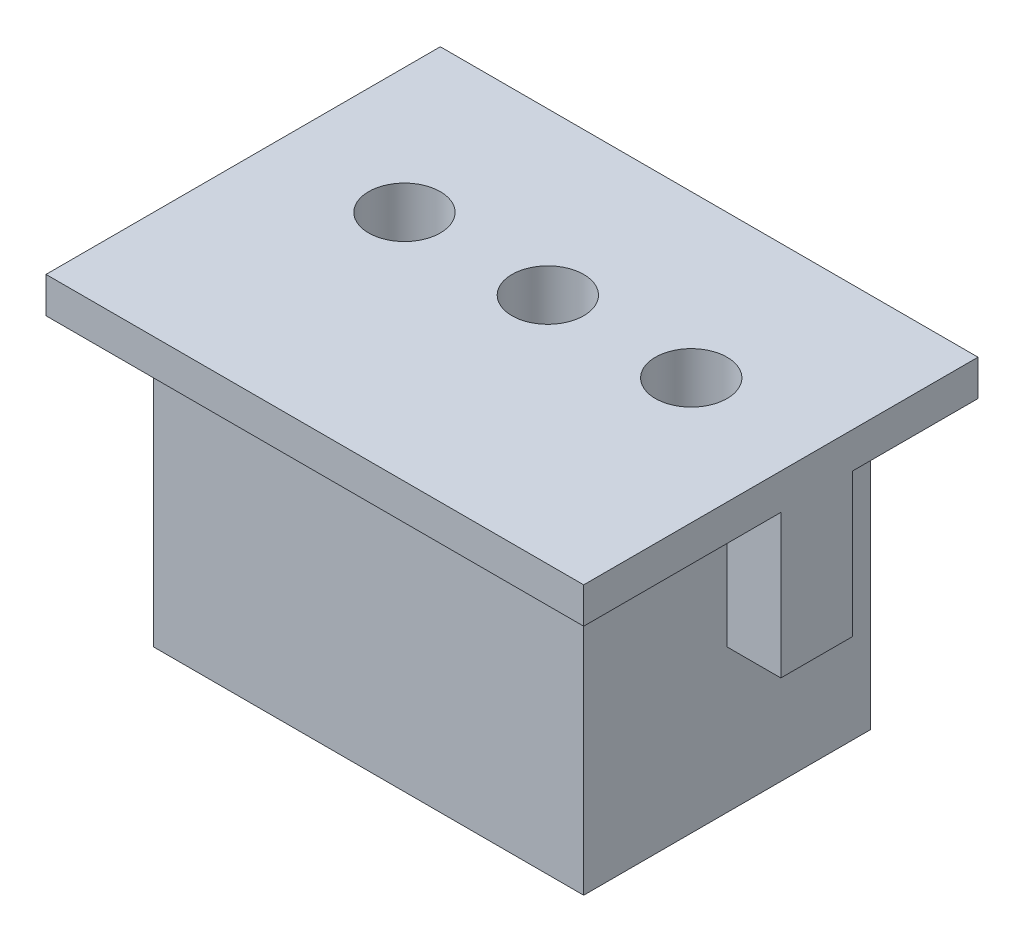
ISO-10303-21;
HEADER;
FILE_DESCRIPTION(('STEP AP214'),'2;1');
FILE_NAME('part.step','',(''),(''),'','','');
FILE_SCHEMA(('AUTOMOTIVE_DESIGN { 1 0 10303 214 1 1 1 1 }'));
ENDSEC;
DATA;
#1=APPLICATION_CONTEXT('core data for automotive mechanical design processes');
#2=APPLICATION_PROTOCOL_DEFINITION('international standard','automotive_design',2000,#1);
#3=PRODUCT_CONTEXT('',#1,'mechanical');
#4=PRODUCT('Part','Part','',(#3));
#5=PRODUCT_RELATED_PRODUCT_CATEGORY('part','',(#4));
#6=PRODUCT_DEFINITION_FORMATION('','',#4);
#7=PRODUCT_DEFINITION_CONTEXT('part definition',#1,'design');
#8=PRODUCT_DEFINITION('design','',#6,#7);
#9=PRODUCT_DEFINITION_SHAPE('','',#8);
#10=(LENGTH_UNIT() NAMED_UNIT(*) SI_UNIT(.MILLI.,.METRE.));
#11=(NAMED_UNIT(*) PLANE_ANGLE_UNIT() SI_UNIT($,.RADIAN.));
#12=(NAMED_UNIT(*) SI_UNIT($,.STERADIAN.) SOLID_ANGLE_UNIT());
#13=UNCERTAINTY_MEASURE_WITH_UNIT(LENGTH_MEASURE(1.E-05),#10,'distance_accuracy_value','');
#14=(GEOMETRIC_REPRESENTATION_CONTEXT(3) GLOBAL_UNCERTAINTY_ASSIGNED_CONTEXT((#13)) GLOBAL_UNIT_ASSIGNED_CONTEXT((#10,
#11,#12)) REPRESENTATION_CONTEXT('',''));
#15=CARTESIAN_POINT('',(0.,0.,0.));
#16=DIRECTION('',(0.,0.,1.));
#17=DIRECTION('',(1.,0.,0.));
#18=AXIS2_PLACEMENT_3D('',#15,#16,#17);
#19=CARTESIAN_POINT('',(3.,4.,2.));
#20=DIRECTION('',(-1.,0.,0.));
#21=DIRECTION('',(0.,0.,1.));
#22=AXIS2_PLACEMENT_3D('',#19,#20,#21);
#23=PLANE('',#22);
#24=DIRECTION('',(0.,1.,0.));
#25=VECTOR('',#24,1.);
#26=CARTESIAN_POINT('',(3.,2.,-1.));
#27=LINE('',#26,#25);
#28=CARTESIAN_POINT('',(3.,2.,-1.));
#29=VERTEX_POINT('',#28);
#30=CARTESIAN_POINT('',(3.,4.,-1.));
#31=VERTEX_POINT('',#30);
#32=EDGE_CURVE('E64',#29,#31,#27,.T.);
#33=ORIENTED_EDGE('',*,*,#32,.F.);
#34=DIRECTION('',(0.,0.,-1.));
#35=VECTOR('',#34,1.);
#36=CARTESIAN_POINT('',(3.,2.,0.));
#37=LINE('',#36,#35);
#38=CARTESIAN_POINT('',(3.,2.,0.));
#39=VERTEX_POINT('',#38);
#40=EDGE_CURVE('E360',#39,#29,#37,.T.);
#41=ORIENTED_EDGE('',*,*,#40,.F.);
#42=DIRECTION('',(0.,-1.,0.));
#43=VECTOR('',#42,1.);
#44=CARTESIAN_POINT('',(3.,4.,0.));
#45=LINE('',#44,#43);
#46=CARTESIAN_POINT('',(3.,4.,0.));
#47=VERTEX_POINT('',#46);
#48=EDGE_CURVE('E380',#47,#39,#45,.T.);
#49=ORIENTED_EDGE('',*,*,#48,.F.);
#50=DIRECTION('',(0.,0.,-1.));
#51=VECTOR('',#50,1.);
#52=CARTESIAN_POINT('',(3.,4.,2.));
#53=LINE('',#52,#51);
#54=CARTESIAN_POINT('',(3.,4.,2.));
#55=VERTEX_POINT('',#54);
#56=EDGE_CURVE('E328',#55,#47,#53,.T.);
#57=ORIENTED_EDGE('',*,*,#56,.F.);
#58=DIRECTION('',(0.,-1.,0.));
#59=VECTOR('',#58,1.);
#60=CARTESIAN_POINT('',(3.,4.,2.));
#61=LINE('',#60,#59);
#62=CARTESIAN_POINT('',(3.,0.,2.));
#63=VERTEX_POINT('',#62);
#64=EDGE_CURVE('E320',#55,#63,#61,.T.);
#65=ORIENTED_EDGE('',*,*,#64,.T.);
#66=DIRECTION('',(0.,0.,-1.));
#67=VECTOR('',#66,1.);
#68=CARTESIAN_POINT('',(3.,0.,2.));
#69=LINE('',#68,#67);
#70=CARTESIAN_POINT('',(3.,0.,-2.));
#71=VERTEX_POINT('',#70);
#72=EDGE_CURVE('E298',#63,#71,#69,.T.);
#73=ORIENTED_EDGE('',*,*,#72,.T.);
#74=DIRECTION('',(0.,-1.,0.));
#75=VECTOR('',#74,1.);
#76=CARTESIAN_POINT('',(3.,4.,-2.));
#77=LINE('',#76,#75);
#78=CARTESIAN_POINT('',(3.,4.,-2.));
#79=VERTEX_POINT('',#78);
#80=EDGE_CURVE('E11',#79,#71,#77,.T.);
#81=ORIENTED_EDGE('',*,*,#80,.F.);
#82=EDGE_CURVE('E319',#31,#79,#53,.T.);
#83=ORIENTED_EDGE('',*,*,#82,.F.);
#84=EDGE_LOOP('',(#33,#41,#49,#57,#65,#73,#81,#83));
#85=FACE_BOUND('',#84,.T.);
#86=ADVANCED_FACE('F39',(#85),#23,.F.);
#87=CARTESIAN_POINT('',(-3.,4.,-2.));
#88=DIRECTION('',(0.,0.,1.));
#89=DIRECTION('',(1.,0.,0.));
#90=AXIS2_PLACEMENT_3D('',#87,#88,#89);
#91=PLANE('',#90);
#92=DIRECTION('',(-1.,0.,0.));
#93=VECTOR('',#92,1.);
#94=CARTESIAN_POINT('',(-3.,0.,-2.));
#95=LINE('',#94,#93);
#96=CARTESIAN_POINT('',(-3.,0.,-2.));
#97=VERTEX_POINT('',#96);
#98=EDGE_CURVE('E301',#71,#97,#95,.T.);
#99=ORIENTED_EDGE('',*,*,#98,.T.);
#100=DIRECTION('',(0.,-1.,0.));
#101=VECTOR('',#100,1.);
#102=CARTESIAN_POINT('',(-3.,4.,-2.));
#103=LINE('',#102,#101);
#104=CARTESIAN_POINT('',(-3.,4.,-2.));
#105=VERTEX_POINT('',#104);
#106=EDGE_CURVE('E48',#105,#97,#103,.T.);
#107=ORIENTED_EDGE('',*,*,#106,.F.);
#108=DIRECTION('',(-1.,0.,0.));
#109=VECTOR('',#108,1.);
#110=CARTESIAN_POINT('',(-3.,4.,-2.));
#111=LINE('',#110,#109);
#112=EDGE_CURVE('E332',#79,#105,#111,.T.);
#113=ORIENTED_EDGE('',*,*,#112,.F.);
#114=ORIENTED_EDGE('',*,*,#80,.T.);
#115=EDGE_LOOP('',(#99,#107,#113,#114));
#116=FACE_BOUND('',#115,.T.);
#117=ADVANCED_FACE('F433',(#116),#91,.F.);
#118=CARTESIAN_POINT('',(-3.,4.,2.));
#119=DIRECTION('',(1.,0.,0.));
#120=DIRECTION('',(0.,0.,-1.));
#121=AXIS2_PLACEMENT_3D('',#118,#119,#120);
#122=PLANE('',#121);
#123=DIRECTION('',(0.,0.,1.));
#124=VECTOR('',#123,1.);
#125=CARTESIAN_POINT('',(-3.,4.,2.));
#126=LINE('',#125,#124);
#127=CARTESIAN_POINT('',(-3.,4.,0.));
#128=VERTEX_POINT('',#127);
#129=CARTESIAN_POINT('',(-3.,4.,2.));
#130=VERTEX_POINT('',#129);
#131=EDGE_CURVE('E341',#128,#130,#126,.T.);
#132=ORIENTED_EDGE('',*,*,#131,.F.);
#133=DIRECTION('',(0.,-1.,0.));
#134=VECTOR('',#133,1.);
#135=CARTESIAN_POINT('',(-3.,4.,0.));
#136=LINE('',#135,#134);
#137=CARTESIAN_POINT('',(-3.,2.,0.));
#138=VERTEX_POINT('',#137);
#139=EDGE_CURVE('E397',#128,#138,#136,.T.);
#140=ORIENTED_EDGE('',*,*,#139,.T.);
#141=DIRECTION('',(0.,0.,-1.));
#142=VECTOR('',#141,1.);
#143=CARTESIAN_POINT('',(-3.,2.,0.));
#144=LINE('',#143,#142);
#145=CARTESIAN_POINT('',(-3.,2.,-1.));
#146=VERTEX_POINT('',#145);
#147=EDGE_CURVE('E196',#138,#146,#144,.T.);
#148=ORIENTED_EDGE('',*,*,#147,.T.);
#149=DIRECTION('',(0.,1.,0.));
#150=VECTOR('',#149,1.);
#151=CARTESIAN_POINT('',(-3.,2.,-1.));
#152=LINE('',#151,#150);
#153=CARTESIAN_POINT('',(-3.,4.,-1.));
#154=VERTEX_POINT('',#153);
#155=EDGE_CURVE('E194',#146,#154,#152,.T.);
#156=ORIENTED_EDGE('',*,*,#155,.T.);
#157=EDGE_CURVE('E346',#105,#154,#126,.T.);
#158=ORIENTED_EDGE('',*,*,#157,.F.);
#159=ORIENTED_EDGE('',*,*,#106,.T.);
#160=DIRECTION('',(0.,0.,1.));
#161=VECTOR('',#160,1.);
#162=CARTESIAN_POINT('',(-3.,0.,2.));
#163=LINE('',#162,#161);
#164=CARTESIAN_POINT('',(-3.,0.,2.));
#165=VERTEX_POINT('',#164);
#166=EDGE_CURVE('E308',#97,#165,#163,.T.);
#167=ORIENTED_EDGE('',*,*,#166,.T.);
#168=DIRECTION('',(0.,-1.,0.));
#169=VECTOR('',#168,1.);
#170=CARTESIAN_POINT('',(-3.,4.,2.));
#171=LINE('',#170,#169);
#172=EDGE_CURVE('E323',#130,#165,#171,.T.);
#173=ORIENTED_EDGE('',*,*,#172,.F.);
#174=EDGE_LOOP('',(#132,#140,#148,#156,#158,#159,#167,#173));
#175=FACE_BOUND('',#174,.T.);
#176=ADVANCED_FACE('F428',(#175),#122,.F.);
#177=CARTESIAN_POINT('',(-3.,4.,2.));
#178=DIRECTION('',(0.,0.,-1.));
#179=DIRECTION('',(-1.,0.,0.));
#180=AXIS2_PLACEMENT_3D('',#177,#178,#179);
#181=PLANE('',#180);
#182=DIRECTION('',(1.,0.,0.));
#183=VECTOR('',#182,1.);
#184=CARTESIAN_POINT('',(-3.,0.,2.));
#185=LINE('',#184,#183);
#186=EDGE_CURVE('E300',#165,#63,#185,.T.);
#187=ORIENTED_EDGE('',*,*,#186,.T.);
#188=ORIENTED_EDGE('',*,*,#64,.F.);
#189=DIRECTION('',(1.,0.,0.));
#190=VECTOR('',#189,1.);
#191=CARTESIAN_POINT('',(-3.,4.,2.));
#192=LINE('',#191,#190);
#193=EDGE_CURVE('E314',#130,#55,#192,.T.);
#194=ORIENTED_EDGE('',*,*,#193,.F.);
#195=ORIENTED_EDGE('',*,*,#172,.T.);
#196=EDGE_LOOP('',(#187,#188,#194,#195));
#197=FACE_BOUND('',#196,.T.);
#198=ADVANCED_FACE('F289',(#197),#181,.F.);
#199=CARTESIAN_POINT('',(0.,0.,0.));
#200=DIRECTION('',(0.,-1.,0.));
#201=DIRECTION('',(0.,0.,-1.));
#202=AXIS2_PLACEMENT_3D('',#199,#200,#201);
#203=PLANE('',#202);
#204=CARTESIAN_POINT('',(2.,0.,-0.5));
#205=DIRECTION('',(0.,-1.,0.));
#206=DIRECTION('',(0.,0.,-1.));
#207=AXIS2_PLACEMENT_3D('',#204,#205,#206);
#208=CIRCLE('',#207,0.5);
#209=CARTESIAN_POINT('',(2.,0.,-1.));
#210=VERTEX_POINT('',#209);
#211=EDGE_CURVE('E269',#210,#210,#208,.T.);
#212=ORIENTED_EDGE('',*,*,#211,.F.);
#213=EDGE_LOOP('',(#212));
#214=FACE_BOUND('',#213,.T.);
#215=CARTESIAN_POINT('',(0.,0.,-0.5));
#216=DIRECTION('',(0.,-1.,0.));
#217=DIRECTION('',(0.,0.,-1.));
#218=AXIS2_PLACEMENT_3D('',#215,#216,#217);
#219=CIRCLE('',#218,0.5);
#220=CARTESIAN_POINT('',(0.,0.,-1.));
#221=VERTEX_POINT('',#220);
#222=EDGE_CURVE('E263',#221,#221,#219,.T.);
#223=ORIENTED_EDGE('',*,*,#222,.F.);
#224=EDGE_LOOP('',(#223));
#225=FACE_BOUND('',#224,.T.);
#226=CARTESIAN_POINT('',(-2.,0.,-0.5));
#227=DIRECTION('',(0.,-1.,0.));
#228=DIRECTION('',(0.,0.,-1.));
#229=AXIS2_PLACEMENT_3D('',#226,#227,#228);
#230=CIRCLE('',#229,0.5);
#231=CARTESIAN_POINT('',(-2.,0.,-1.));
#232=VERTEX_POINT('',#231);
#233=EDGE_CURVE('E255',#232,#232,#230,.T.);
#234=ORIENTED_EDGE('',*,*,#233,.F.);
#235=EDGE_LOOP('',(#234));
#236=FACE_BOUND('',#235,.T.);
#237=ORIENTED_EDGE('',*,*,#72,.F.);
#238=ORIENTED_EDGE('',*,*,#186,.F.);
#239=ORIENTED_EDGE('',*,*,#166,.F.);
#240=ORIENTED_EDGE('',*,*,#98,.F.);
#241=EDGE_LOOP('',(#237,#238,#239,#240));
#242=FACE_BOUND('',#241,.T.);
#243=ADVANCED_FACE('F285',(#214,#225,#236,#242),#203,.T.);
#244=CARTESIAN_POINT('',(3.75,4.,0.));
#245=DIRECTION('',(0.,0.,-1.));
#246=DIRECTION('',(0.,1.,0.));
#247=AXIS2_PLACEMENT_3D('',#244,#245,#246);
#248=PLANE('',#247);
#249=ORIENTED_EDGE('',*,*,#48,.T.);
#250=DIRECTION('',(-1.,0.,0.));
#251=VECTOR('',#250,1.);
#252=CARTESIAN_POINT('',(3.75,2.,0.));
#253=LINE('',#252,#251);
#254=CARTESIAN_POINT('',(3.75,2.,0.));
#255=VERTEX_POINT('',#254);
#256=EDGE_CURVE('E311',#255,#39,#253,.T.);
#257=ORIENTED_EDGE('',*,*,#256,.F.);
#258=DIRECTION('',(0.,-1.,0.));
#259=VECTOR('',#258,1.);
#260=CARTESIAN_POINT('',(3.75,4.,0.));
#261=LINE('',#260,#259);
#262=CARTESIAN_POINT('',(3.75,4.,0.));
#263=VERTEX_POINT('',#262);
#264=EDGE_CURVE('E249',#263,#255,#261,.T.);
#265=ORIENTED_EDGE('',*,*,#264,.F.);
#266=DIRECTION('',(-1.,0.,0.));
#267=VECTOR('',#266,1.);
#268=CARTESIAN_POINT('',(3.75,4.,0.));
#269=LINE('',#268,#267);
#270=EDGE_CURVE('E248',#263,#47,#269,.T.);
#271=ORIENTED_EDGE('',*,*,#270,.T.);
#272=EDGE_LOOP('',(#249,#257,#265,#271));
#273=FACE_BOUND('',#272,.T.);
#274=ADVANCED_FACE('F288',(#273),#248,.F.);
#275=CARTESIAN_POINT('',(3.75,2.,0.));
#276=DIRECTION('',(0.,1.,0.));
#277=DIRECTION('',(0.,0.,1.));
#278=AXIS2_PLACEMENT_3D('',#275,#276,#277);
#279=PLANE('',#278);
#280=ORIENTED_EDGE('',*,*,#40,.T.);
#281=DIRECTION('',(-1.,0.,0.));
#282=VECTOR('',#281,1.);
#283=CARTESIAN_POINT('',(3.75,2.,-1.));
#284=LINE('',#283,#282);
#285=CARTESIAN_POINT('',(3.75,2.,-1.));
#286=VERTEX_POINT('',#285);
#287=EDGE_CURVE('E355',#286,#29,#284,.T.);
#288=ORIENTED_EDGE('',*,*,#287,.F.);
#289=DIRECTION('',(0.,0.,-1.));
#290=VECTOR('',#289,1.);
#291=CARTESIAN_POINT('',(3.75,2.,0.));
#292=LINE('',#291,#290);
#293=EDGE_CURVE('E377',#255,#286,#292,.T.);
#294=ORIENTED_EDGE('',*,*,#293,.F.);
#295=ORIENTED_EDGE('',*,*,#256,.T.);
#296=EDGE_LOOP('',(#280,#288,#294,#295));
#297=FACE_BOUND('',#296,.T.);
#298=ADVANCED_FACE('F376',(#297),#279,.F.);
#299=CARTESIAN_POINT('',(3.75,2.,-1.));
#300=DIRECTION('',(0.,0.,1.));
#301=DIRECTION('',(1.,0.,0.));
#302=AXIS2_PLACEMENT_3D('',#299,#300,#301);
#303=PLANE('',#302);
#304=ORIENTED_EDGE('',*,*,#32,.T.);
#305=DIRECTION('',(-1.,0.,0.));
#306=VECTOR('',#305,1.);
#307=CARTESIAN_POINT('',(3.75,4.,-1.));
#308=LINE('',#307,#306);
#309=CARTESIAN_POINT('',(3.75,4.,-1.));
#310=VERTEX_POINT('',#309);
#311=EDGE_CURVE('E351',#310,#31,#308,.T.);
#312=ORIENTED_EDGE('',*,*,#311,.F.);
#313=DIRECTION('',(0.,1.,0.));
#314=VECTOR('',#313,1.);
#315=CARTESIAN_POINT('',(3.75,2.,-1.));
#316=LINE('',#315,#314);
#317=EDGE_CURVE('E356',#286,#310,#316,.T.);
#318=ORIENTED_EDGE('',*,*,#317,.F.);
#319=ORIENTED_EDGE('',*,*,#287,.T.);
#320=EDGE_LOOP('',(#304,#312,#318,#319));
#321=FACE_BOUND('',#320,.T.);
#322=ADVANCED_FACE('F449',(#321),#303,.F.);
#323=CARTESIAN_POINT('',(3.75,0.,0.));
#324=DIRECTION('',(1.,0.,0.));
#325=DIRECTION('',(0.,0.,-1.));
#326=AXIS2_PLACEMENT_3D('',#323,#324,#325);
#327=PLANE('',#326);
#328=ORIENTED_EDGE('',*,*,#317,.T.);
#329=DIRECTION('',(0.,0.,-1.));
#330=VECTOR('',#329,1.);
#331=CARTESIAN_POINT('',(3.75,4.,2.75));
#332=LINE('',#331,#330);
#333=CARTESIAN_POINT('',(3.75,4.,-2.75));
#334=VERTEX_POINT('',#333);
#335=EDGE_CURVE('E192',#310,#334,#332,.T.);
#336=ORIENTED_EDGE('',*,*,#335,.T.);
#337=DIRECTION('',(0.,-1.,0.));
#338=VECTOR('',#337,1.);
#339=CARTESIAN_POINT('',(3.75,4.5,-2.75));
#340=LINE('',#339,#338);
#341=CARTESIAN_POINT('',(3.75,4.5,-2.75));
#342=VERTEX_POINT('',#341);
#343=EDGE_CURVE('E171',#342,#334,#340,.T.);
#344=ORIENTED_EDGE('',*,*,#343,.F.);
#345=DIRECTION('',(0.,0.,-1.));
#346=VECTOR('',#345,1.);
#347=CARTESIAN_POINT('',(3.75,4.5,2.75));
#348=LINE('',#347,#346);
#349=CARTESIAN_POINT('',(3.75,4.5,2.75));
#350=VERTEX_POINT('',#349);
#351=EDGE_CURVE('E178',#350,#342,#348,.T.);
#352=ORIENTED_EDGE('',*,*,#351,.F.);
#353=DIRECTION('',(0.,-1.,0.));
#354=VECTOR('',#353,1.);
#355=CARTESIAN_POINT('',(3.75,4.5,2.75));
#356=LINE('',#355,#354);
#357=CARTESIAN_POINT('',(3.75,4.,2.75));
#358=VERTEX_POINT('',#357);
#359=EDGE_CURVE('E242',#350,#358,#356,.T.);
#360=ORIENTED_EDGE('',*,*,#359,.T.);
#361=EDGE_CURVE('E202',#358,#263,#332,.T.);
#362=ORIENTED_EDGE('',*,*,#361,.T.);
#363=ORIENTED_EDGE('',*,*,#264,.T.);
#364=ORIENTED_EDGE('',*,*,#293,.T.);
#365=EDGE_LOOP('',(#328,#336,#344,#352,#360,#362,#363,#364));
#366=FACE_BOUND('',#365,.T.);
#367=ADVANCED_FACE('F190',(#366),#327,.T.);
#368=CARTESIAN_POINT('',(-3.75,2.,-1.));
#369=DIRECTION('',(0.,0.,-1.));
#370=DIRECTION('',(-1.,0.,0.));
#371=AXIS2_PLACEMENT_3D('',#368,#369,#370);
#372=PLANE('',#371);
#373=ORIENTED_EDGE('',*,*,#155,.F.);
#374=DIRECTION('',(1.,0.,0.));
#375=VECTOR('',#374,1.);
#376=CARTESIAN_POINT('',(-3.75,2.,-1.));
#377=LINE('',#376,#375);
#378=CARTESIAN_POINT('',(-3.75,2.,-1.));
#379=VERTEX_POINT('',#378);
#380=EDGE_CURVE('E383',#379,#146,#377,.T.);
#381=ORIENTED_EDGE('',*,*,#380,.F.);
#382=DIRECTION('',(0.,1.,0.));
#383=VECTOR('',#382,1.);
#384=CARTESIAN_POINT('',(-3.75,2.,-1.));
#385=LINE('',#384,#383);
#386=CARTESIAN_POINT('',(-3.75,4.,-1.));
#387=VERTEX_POINT('',#386);
#388=EDGE_CURVE('E400',#379,#387,#385,.T.);
#389=ORIENTED_EDGE('',*,*,#388,.T.);
#390=DIRECTION('',(1.,0.,0.));
#391=VECTOR('',#390,1.);
#392=CARTESIAN_POINT('',(-3.75,4.,-1.));
#393=LINE('',#392,#391);
#394=EDGE_CURVE('E56',#387,#154,#393,.T.);
#395=ORIENTED_EDGE('',*,*,#394,.T.);
#396=EDGE_LOOP('',(#373,#381,#389,#395));
#397=FACE_BOUND('',#396,.T.);
#398=ADVANCED_FACE('F454',(#397),#372,.T.);
#399=CARTESIAN_POINT('',(-3.75,2.,0.));
#400=DIRECTION('',(0.,-1.,0.));
#401=DIRECTION('',(0.,0.,-1.));
#402=AXIS2_PLACEMENT_3D('',#399,#400,#401);
#403=PLANE('',#402);
#404=ORIENTED_EDGE('',*,*,#147,.F.);
#405=DIRECTION('',(1.,0.,0.));
#406=VECTOR('',#405,1.);
#407=CARTESIAN_POINT('',(-3.75,2.,0.));
#408=LINE('',#407,#406);
#409=CARTESIAN_POINT('',(-3.75,2.,0.));
#410=VERTEX_POINT('',#409);
#411=EDGE_CURVE('E387',#410,#138,#408,.T.);
#412=ORIENTED_EDGE('',*,*,#411,.F.);
#413=DIRECTION('',(0.,0.,-1.));
#414=VECTOR('',#413,1.);
#415=CARTESIAN_POINT('',(-3.75,2.,0.));
#416=LINE('',#415,#414);
#417=EDGE_CURVE('E404',#410,#379,#416,.T.);
#418=ORIENTED_EDGE('',*,*,#417,.T.);
#419=ORIENTED_EDGE('',*,*,#380,.T.);
#420=EDGE_LOOP('',(#404,#412,#418,#419));
#421=FACE_BOUND('',#420,.T.);
#422=ADVANCED_FACE('F420',(#421),#403,.T.);
#423=CARTESIAN_POINT('',(-3.75,4.,0.));
#424=DIRECTION('',(0.,0.,1.));
#425=DIRECTION('',(0.,-1.,0.));
#426=AXIS2_PLACEMENT_3D('',#423,#424,#425);
#427=PLANE('',#426);
#428=ORIENTED_EDGE('',*,*,#139,.F.);
#429=DIRECTION('',(1.,0.,0.));
#430=VECTOR('',#429,1.);
#431=CARTESIAN_POINT('',(-3.75,4.,0.));
#432=LINE('',#431,#430);
#433=CARTESIAN_POINT('',(-3.75,4.,0.));
#434=VERTEX_POINT('',#433);
#435=EDGE_CURVE('E393',#434,#128,#432,.T.);
#436=ORIENTED_EDGE('',*,*,#435,.F.);
#437=DIRECTION('',(0.,-1.,0.));
#438=VECTOR('',#437,1.);
#439=CARTESIAN_POINT('',(-3.75,4.,0.));
#440=LINE('',#439,#438);
#441=EDGE_CURVE('E236',#434,#410,#440,.T.);
#442=ORIENTED_EDGE('',*,*,#441,.T.);
#443=ORIENTED_EDGE('',*,*,#411,.T.);
#444=EDGE_LOOP('',(#428,#436,#442,#443));
#445=FACE_BOUND('',#444,.T.);
#446=ADVANCED_FACE('F422',(#445),#427,.T.);
#447=CARTESIAN_POINT('',(-3.75,0.,0.));
#448=DIRECTION('',(-1.,0.,0.));
#449=DIRECTION('',(0.,0.,-1.));
#450=AXIS2_PLACEMENT_3D('',#447,#448,#449);
#451=PLANE('',#450);
#452=ORIENTED_EDGE('',*,*,#441,.F.);
#453=DIRECTION('',(0.,0.,1.));
#454=VECTOR('',#453,1.);
#455=CARTESIAN_POINT('',(-3.75,4.,2.75));
#456=LINE('',#455,#454);
#457=CARTESIAN_POINT('',(-3.75,4.,2.75));
#458=VERTEX_POINT('',#457);
#459=EDGE_CURVE('E216',#434,#458,#456,.T.);
#460=ORIENTED_EDGE('',*,*,#459,.T.);
#461=DIRECTION('',(0.,-1.,0.));
#462=VECTOR('',#461,1.);
#463=CARTESIAN_POINT('',(-3.75,4.5,2.75));
#464=LINE('',#463,#462);
#465=CARTESIAN_POINT('',(-3.75,4.5,2.75));
#466=VERTEX_POINT('',#465);
#467=EDGE_CURVE('E198',#466,#458,#464,.T.);
#468=ORIENTED_EDGE('',*,*,#467,.F.);
#469=DIRECTION('',(0.,0.,1.));
#470=VECTOR('',#469,1.);
#471=CARTESIAN_POINT('',(-3.75,4.5,2.75));
#472=LINE('',#471,#470);
#473=CARTESIAN_POINT('',(-3.75,4.5,-2.75));
#474=VERTEX_POINT('',#473);
#475=EDGE_CURVE('E177',#474,#466,#472,.T.);
#476=ORIENTED_EDGE('',*,*,#475,.F.);
#477=DIRECTION('',(0.,-1.,0.));
#478=VECTOR('',#477,1.);
#479=CARTESIAN_POINT('',(-3.75,4.5,-2.75));
#480=LINE('',#479,#478);
#481=CARTESIAN_POINT('',(-3.75,4.,-2.75));
#482=VERTEX_POINT('',#481);
#483=EDGE_CURVE('E173',#474,#482,#480,.T.);
#484=ORIENTED_EDGE('',*,*,#483,.T.);
#485=EDGE_CURVE('E223',#482,#387,#456,.T.);
#486=ORIENTED_EDGE('',*,*,#485,.T.);
#487=ORIENTED_EDGE('',*,*,#388,.F.);
#488=ORIENTED_EDGE('',*,*,#417,.F.);
#489=EDGE_LOOP('',(#452,#460,#468,#476,#484,#486,#487,#488));
#490=FACE_BOUND('',#489,.T.);
#491=ADVANCED_FACE('F233',(#490),#451,.T.);
#492=CARTESIAN_POINT('',(0.,4.,0.));
#493=DIRECTION('',(0.,-1.,0.));
#494=DIRECTION('',(0.,0.,-1.));
#495=AXIS2_PLACEMENT_3D('',#492,#493,#494);
#496=PLANE('',#495);
#497=ORIENTED_EDGE('',*,*,#270,.F.);
#498=ORIENTED_EDGE('',*,*,#361,.F.);
#499=DIRECTION('',(1.,0.,0.));
#500=VECTOR('',#499,1.);
#501=CARTESIAN_POINT('',(-3.75,4.,2.75));
#502=LINE('',#501,#500);
#503=EDGE_CURVE('E188',#458,#358,#502,.T.);
#504=ORIENTED_EDGE('',*,*,#503,.F.);
#505=ORIENTED_EDGE('',*,*,#459,.F.);
#506=ORIENTED_EDGE('',*,*,#435,.T.);
#507=ORIENTED_EDGE('',*,*,#131,.T.);
#508=ORIENTED_EDGE('',*,*,#193,.T.);
#509=ORIENTED_EDGE('',*,*,#56,.T.);
#510=EDGE_LOOP('',(#497,#498,#504,#505,#506,#507,#508,#509));
#511=FACE_BOUND('',#510,.T.);
#512=ADVANCED_FACE('F245',(#511),#496,.T.);
#513=CARTESIAN_POINT('',(-3.75,4.5,-2.75));
#514=DIRECTION('',(0.,0.,1.));
#515=DIRECTION('',(1.,0.,0.));
#516=AXIS2_PLACEMENT_3D('',#513,#514,#515);
#517=PLANE('',#516);
#518=DIRECTION('',(-1.,0.,0.));
#519=VECTOR('',#518,1.);
#520=CARTESIAN_POINT('',(-3.75,4.,-2.75));
#521=LINE('',#520,#519);
#522=EDGE_CURVE('E207',#334,#482,#521,.T.);
#523=ORIENTED_EDGE('',*,*,#522,.T.);
#524=ORIENTED_EDGE('',*,*,#483,.F.);
#525=DIRECTION('',(-1.,0.,0.));
#526=VECTOR('',#525,1.);
#527=CARTESIAN_POINT('',(-3.75,4.5,-2.75));
#528=LINE('',#527,#526);
#529=EDGE_CURVE('E167',#342,#474,#528,.T.);
#530=ORIENTED_EDGE('',*,*,#529,.F.);
#531=ORIENTED_EDGE('',*,*,#343,.T.);
#532=EDGE_LOOP('',(#523,#524,#530,#531));
#533=FACE_BOUND('',#532,.T.);
#534=ADVANCED_FACE('F169',(#533),#517,.F.);
#535=CARTESIAN_POINT('',(-3.75,4.5,2.75));
#536=DIRECTION('',(0.,0.,-1.));
#537=DIRECTION('',(-1.,0.,0.));
#538=AXIS2_PLACEMENT_3D('',#535,#536,#537);
#539=PLANE('',#538);
#540=ORIENTED_EDGE('',*,*,#503,.T.);
#541=ORIENTED_EDGE('',*,*,#359,.F.);
#542=DIRECTION('',(1.,0.,0.));
#543=VECTOR('',#542,1.);
#544=CARTESIAN_POINT('',(-3.75,4.5,2.75));
#545=LINE('',#544,#543);
#546=EDGE_CURVE('E183',#466,#350,#545,.T.);
#547=ORIENTED_EDGE('',*,*,#546,.F.);
#548=ORIENTED_EDGE('',*,*,#467,.T.);
#549=EDGE_LOOP('',(#540,#541,#547,#548));
#550=FACE_BOUND('',#549,.T.);
#551=ADVANCED_FACE('F241',(#550),#539,.F.);
#552=CARTESIAN_POINT('',(0.,4.5,0.));
#553=DIRECTION('',(0.,-1.,0.));
#554=DIRECTION('',(0.,0.,-1.));
#555=AXIS2_PLACEMENT_3D('',#552,#553,#554);
#556=PLANE('',#555);
#557=CARTESIAN_POINT('',(2.,4.5,-0.5));
#558=DIRECTION('',(0.,-1.,0.));
#559=DIRECTION('',(0.,0.,-1.));
#560=AXIS2_PLACEMENT_3D('',#557,#558,#559);
#561=CIRCLE('',#560,0.5);
#562=CARTESIAN_POINT('',(2.,4.5,-1.));
#563=VERTEX_POINT('',#562);
#564=EDGE_CURVE('E266',#563,#563,#561,.T.);
#565=ORIENTED_EDGE('',*,*,#564,.T.);
#566=EDGE_LOOP('',(#565));
#567=FACE_BOUND('',#566,.T.);
#568=CARTESIAN_POINT('',(0.,4.5,-0.5));
#569=DIRECTION('',(0.,-1.,0.));
#570=DIRECTION('',(0.,0.,-1.));
#571=AXIS2_PLACEMENT_3D('',#568,#569,#570);
#572=CIRCLE('',#571,0.5);
#573=CARTESIAN_POINT('',(0.,4.5,-1.));
#574=VERTEX_POINT('',#573);
#575=EDGE_CURVE('E259',#574,#574,#572,.T.);
#576=ORIENTED_EDGE('',*,*,#575,.T.);
#577=EDGE_LOOP('',(#576));
#578=FACE_BOUND('',#577,.T.);
#579=CARTESIAN_POINT('',(-2.,4.5,-0.5));
#580=DIRECTION('',(0.,-1.,0.));
#581=DIRECTION('',(0.,0.,-1.));
#582=AXIS2_PLACEMENT_3D('',#579,#580,#581);
#583=CIRCLE('',#582,0.5);
#584=CARTESIAN_POINT('',(-2.,4.5,-1.));
#585=VERTEX_POINT('',#584);
#586=EDGE_CURVE('E258',#585,#585,#583,.T.);
#587=ORIENTED_EDGE('',*,*,#586,.T.);
#588=EDGE_LOOP('',(#587));
#589=FACE_BOUND('',#588,.T.);
#590=ORIENTED_EDGE('',*,*,#351,.T.);
#591=ORIENTED_EDGE('',*,*,#529,.T.);
#592=ORIENTED_EDGE('',*,*,#475,.T.);
#593=ORIENTED_EDGE('',*,*,#546,.T.);
#594=EDGE_LOOP('',(#590,#591,#592,#593));
#595=FACE_BOUND('',#594,.T.);
#596=ADVANCED_FACE('F181',(#567,#578,#589,#595),#556,.F.);
#597=ORIENTED_EDGE('',*,*,#335,.F.);
#598=ORIENTED_EDGE('',*,*,#311,.T.);
#599=ORIENTED_EDGE('',*,*,#82,.T.);
#600=ORIENTED_EDGE('',*,*,#112,.T.);
#601=ORIENTED_EDGE('',*,*,#157,.T.);
#602=ORIENTED_EDGE('',*,*,#394,.F.);
#603=ORIENTED_EDGE('',*,*,#485,.F.);
#604=ORIENTED_EDGE('',*,*,#522,.F.);
#605=EDGE_LOOP('',(#597,#598,#599,#600,#601,#602,#603,#604));
#606=FACE_BOUND('',#605,.T.);
#607=ADVANCED_FACE('F467',(#606),#496,.T.);
#608=CARTESIAN_POINT('',(-2.,4.5,-0.5));
#609=DIRECTION('',(0.,-1.,0.));
#610=DIRECTION('',(0.,0.,-1.));
#611=AXIS2_PLACEMENT_3D('',#608,#609,#610);
#612=CYLINDRICAL_SURFACE('',#611,0.5);
#613=ORIENTED_EDGE('',*,*,#586,.F.);
#614=EDGE_LOOP('',(#613));
#615=FACE_BOUND('',#614,.T.);
#616=ORIENTED_EDGE('',*,*,#233,.T.);
#617=EDGE_LOOP('',(#616));
#618=FACE_BOUND('',#617,.T.);
#619=ADVANCED_FACE('F470',(#615,#618),#612,.F.);
#620=CARTESIAN_POINT('',(0.,4.5,-0.5));
#621=DIRECTION('',(0.,-1.,0.));
#622=DIRECTION('',(0.,0.,-1.));
#623=AXIS2_PLACEMENT_3D('',#620,#621,#622);
#624=CYLINDRICAL_SURFACE('',#623,0.5);
#625=ORIENTED_EDGE('',*,*,#575,.F.);
#626=EDGE_LOOP('',(#625));
#627=FACE_BOUND('',#626,.T.);
#628=ORIENTED_EDGE('',*,*,#222,.T.);
#629=EDGE_LOOP('',(#628));
#630=FACE_BOUND('',#629,.T.);
#631=ADVANCED_FACE('F281',(#627,#630),#624,.F.);
#632=CARTESIAN_POINT('',(2.,4.5,-0.5));
#633=DIRECTION('',(0.,-1.,0.));
#634=DIRECTION('',(0.,0.,-1.));
#635=AXIS2_PLACEMENT_3D('',#632,#633,#634);
#636=CYLINDRICAL_SURFACE('',#635,0.5);
#637=ORIENTED_EDGE('',*,*,#564,.F.);
#638=EDGE_LOOP('',(#637));
#639=FACE_BOUND('',#638,.T.);
#640=ORIENTED_EDGE('',*,*,#211,.T.);
#641=EDGE_LOOP('',(#640));
#642=FACE_BOUND('',#641,.T.);
#643=ADVANCED_FACE('F278',(#639,#642),#636,.F.);
#644=CLOSED_SHELL('',(#86,#117,#176,#198,#243,#274,#298,#322,#367,#398,#422,#446,#491,#512,#534,
#551,#596,#607,#619,#631,#643));
#645=MANIFOLD_SOLID_BREP('B2',#644);
#646=ADVANCED_BREP_SHAPE_REPRESENTATION('',(#18,#645),#14);
#647=SHAPE_DEFINITION_REPRESENTATION(#9,#646);
ENDSEC;
END-ISO-10303-21;
